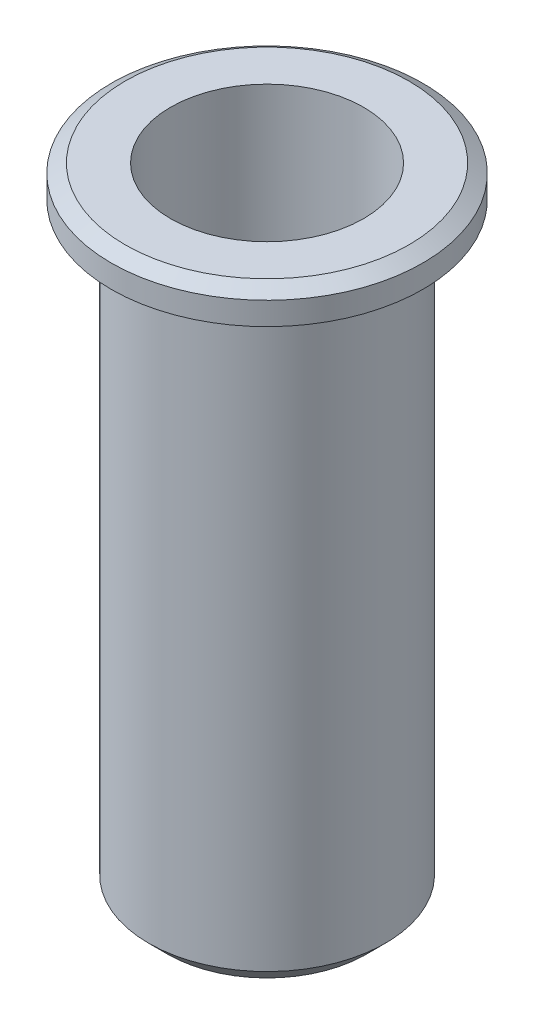
ISO-10303-21;
HEADER;
FILE_DESCRIPTION(('STEP AP214'),'2;1');
FILE_NAME('part.step','',(''),(''),'','','');
FILE_SCHEMA(('AUTOMOTIVE_DESIGN { 1 0 10303 214 1 1 1 1 }'));
ENDSEC;
DATA;
#1=APPLICATION_CONTEXT('core data for automotive mechanical design processes');
#2=APPLICATION_PROTOCOL_DEFINITION('international standard','automotive_design',2000,#1);
#3=PRODUCT_CONTEXT('',#1,'mechanical');
#4=PRODUCT('Part','Part','',(#3));
#5=PRODUCT_RELATED_PRODUCT_CATEGORY('part','',(#4));
#6=PRODUCT_DEFINITION_FORMATION('','',#4);
#7=PRODUCT_DEFINITION_CONTEXT('part definition',#1,'design');
#8=PRODUCT_DEFINITION('design','',#6,#7);
#9=PRODUCT_DEFINITION_SHAPE('','',#8);
#10=(LENGTH_UNIT() NAMED_UNIT(*) SI_UNIT(.MILLI.,.METRE.));
#11=(NAMED_UNIT(*) PLANE_ANGLE_UNIT() SI_UNIT($,.RADIAN.));
#12=(NAMED_UNIT(*) SI_UNIT($,.STERADIAN.) SOLID_ANGLE_UNIT());
#13=UNCERTAINTY_MEASURE_WITH_UNIT(LENGTH_MEASURE(1.E-05),#10,'distance_accuracy_value','');
#14=(GEOMETRIC_REPRESENTATION_CONTEXT(3) GLOBAL_UNCERTAINTY_ASSIGNED_CONTEXT((#13)) GLOBAL_UNIT_ASSIGNED_CONTEXT((#10,
#11,#12)) REPRESENTATION_CONTEXT('',''));
#15=CARTESIAN_POINT('',(0.,0.,0.));
#16=DIRECTION('',(0.,0.,1.));
#17=DIRECTION('',(1.,0.,0.));
#18=AXIS2_PLACEMENT_3D('',#15,#16,#17);
#19=CARTESIAN_POINT('',(0.,25.1479120878423,0.));
#20=DIRECTION('',(0.,1.,0.));
#21=DIRECTION('',(0.,0.,1.));
#22=AXIS2_PLACEMENT_3D('',#19,#20,#21);
#23=CYLINDRICAL_SURFACE('',#22,2.2987);
#24=CARTESIAN_POINT('',(0.,0.,0.));
#25=DIRECTION('',(0.,1.,0.));
#26=DIRECTION('',(0.,0.,1.));
#27=AXIS2_PLACEMENT_3D('',#24,#25,#26);
#28=CIRCLE('',#27,2.2987);
#29=CARTESIAN_POINT('',(0.,0.,2.2987));
#30=VERTEX_POINT('',#29);
#31=EDGE_CURVE('E10',#30,#30,#28,.T.);
#32=ORIENTED_EDGE('',*,*,#31,.F.);
#33=EDGE_LOOP('',(#32));
#34=FACE_BOUND('',#33,.T.);
#35=CARTESIAN_POINT('',(0.,2.36523438534684,0.));
#36=DIRECTION('',(0.,1.,0.));
#37=DIRECTION('',(0.,0.,1.));
#38=AXIS2_PLACEMENT_3D('',#35,#36,#37);
#39=CIRCLE('',#38,2.2987);
#40=CARTESIAN_POINT('',(0.,2.36523438534684,2.2987));
#41=VERTEX_POINT('',#40);
#42=EDGE_CURVE('E72',#41,#41,#39,.T.);
#43=ORIENTED_EDGE('',*,*,#42,.T.);
#44=EDGE_LOOP('',(#43));
#45=FACE_BOUND('',#44,.T.);
#46=ADVANCED_FACE('F40',(#34,#45),#23,.F.);
#47=CARTESIAN_POINT('',(2.2987,0.,0.));
#48=DIRECTION('',(0.,1.,0.));
#49=DIRECTION('',(0.,0.,1.));
#50=AXIS2_PLACEMENT_3D('',#47,#48,#49);
#51=PLANE('',#50);
#52=CARTESIAN_POINT('',(0.,0.,0.));
#53=DIRECTION('',(0.,1.,0.));
#54=DIRECTION('',(0.,0.,1.));
#55=AXIS2_PLACEMENT_3D('',#52,#53,#54);
#56=CIRCLE('',#55,3.98800000000001);
#57=CARTESIAN_POINT('',(0.,0.,3.98800000000001));
#58=VERTEX_POINT('',#57);
#59=EDGE_CURVE('E43',#58,#58,#56,.T.);
#60=ORIENTED_EDGE('',*,*,#59,.F.);
#61=EDGE_LOOP('',(#60));
#62=FACE_BOUND('',#61,.T.);
#63=ORIENTED_EDGE('',*,*,#31,.T.);
#64=EDGE_LOOP('',(#63));
#65=FACE_BOUND('',#64,.T.);
#66=ADVANCED_FACE('F118',(#62,#65),#51,.F.);
#67=CARTESIAN_POINT('',(0.,0.,0.));
#68=DIRECTION('',(0.,1.,0.));
#69=DIRECTION('',(0.,0.,1.));
#70=AXIS2_PLACEMENT_3D('',#67,#68,#69);
#71=CONICAL_SURFACE('',#70,3.98800000000001,0.785398163397447);
#72=CARTESIAN_POINT('',(0.,0.761999999999999,0.));
#73=DIRECTION('',(0.,1.,0.));
#74=DIRECTION('',(0.,0.,1.));
#75=AXIS2_PLACEMENT_3D('',#72,#73,#74);
#76=CIRCLE('',#75,4.75);
#77=CARTESIAN_POINT('',(0.,0.761999999999999,4.75));
#78=VERTEX_POINT('',#77);
#79=EDGE_CURVE('E50',#78,#78,#76,.T.);
#80=ORIENTED_EDGE('',*,*,#79,.F.);
#81=EDGE_LOOP('',(#80));
#82=FACE_BOUND('',#81,.T.);
#83=ORIENTED_EDGE('',*,*,#59,.T.);
#84=EDGE_LOOP('',(#83));
#85=FACE_BOUND('',#84,.T.);
#86=ADVANCED_FACE('F113',(#82,#85),#71,.T.);
#87=CARTESIAN_POINT('',(0.,25.1479120878423,0.));
#88=DIRECTION('',(0.,1.,0.));
#89=DIRECTION('',(0.,0.,1.));
#90=AXIS2_PLACEMENT_3D('',#87,#88,#89);
#91=CYLINDRICAL_SURFACE('',#90,4.75);
#92=CARTESIAN_POINT('',(0.,24.2316,0.));
#93=DIRECTION('',(0.,1.,0.));
#94=DIRECTION('',(0.,0.,1.));
#95=AXIS2_PLACEMENT_3D('',#92,#93,#94);
#96=CIRCLE('',#95,4.75);
#97=CARTESIAN_POINT('',(0.,24.2316,4.75));
#98=VERTEX_POINT('',#97);
#99=EDGE_CURVE('E51',#98,#98,#96,.T.);
#100=ORIENTED_EDGE('',*,*,#99,.F.);
#101=EDGE_LOOP('',(#100));
#102=FACE_BOUND('',#101,.T.);
#103=ORIENTED_EDGE('',*,*,#79,.T.);
#104=EDGE_LOOP('',(#103));
#105=FACE_BOUND('',#104,.T.);
#106=ADVANCED_FACE('F106',(#102,#105),#91,.T.);
#107=CARTESIAN_POINT('',(4.75,24.2316,0.));
#108=DIRECTION('',(0.,1.,0.));
#109=DIRECTION('',(0.,0.,1.));
#110=AXIS2_PLACEMENT_3D('',#107,#108,#109);
#111=PLANE('',#110);
#112=CARTESIAN_POINT('',(0.,24.2316,0.));
#113=DIRECTION('',(0.,1.,0.));
#114=DIRECTION('',(0.,0.,1.));
#115=AXIS2_PLACEMENT_3D('',#112,#113,#114);
#116=CIRCLE('',#115,6.25);
#117=CARTESIAN_POINT('',(0.,24.2316,6.25));
#118=VERTEX_POINT('',#117);
#119=EDGE_CURVE('E57',#118,#118,#116,.T.);
#120=ORIENTED_EDGE('',*,*,#119,.F.);
#121=EDGE_LOOP('',(#120));
#122=FACE_BOUND('',#121,.T.);
#123=ORIENTED_EDGE('',*,*,#99,.T.);
#124=EDGE_LOOP('',(#123));
#125=FACE_BOUND('',#124,.T.);
#126=ADVANCED_FACE('F104',(#122,#125),#111,.F.);
#127=CARTESIAN_POINT('',(0.,25.1479120878423,0.));
#128=DIRECTION('',(0.,1.,0.));
#129=DIRECTION('',(0.,0.,1.));
#130=AXIS2_PLACEMENT_3D('',#127,#128,#129);
#131=CYLINDRICAL_SURFACE('',#130,6.25);
#132=CARTESIAN_POINT('',(0.,25.1479120878423,0.));
#133=DIRECTION('',(0.,1.,0.));
#134=DIRECTION('',(0.,0.,1.));
#135=AXIS2_PLACEMENT_3D('',#132,#133,#134);
#136=CIRCLE('',#135,6.25);
#137=CARTESIAN_POINT('',(0.,25.1479120878423,6.25));
#138=VERTEX_POINT('',#137);
#139=EDGE_CURVE('E56',#138,#138,#136,.T.);
#140=ORIENTED_EDGE('',*,*,#139,.F.);
#141=EDGE_LOOP('',(#140));
#142=FACE_BOUND('',#141,.T.);
#143=ORIENTED_EDGE('',*,*,#119,.T.);
#144=EDGE_LOOP('',(#143));
#145=FACE_BOUND('',#144,.T.);
#146=ADVANCED_FACE('F100',(#142,#145),#131,.T.);
#147=CARTESIAN_POINT('',(0.,25.1479120878423,0.));
#148=DIRECTION('',(0.,-1.,0.));
#149=DIRECTION('',(0.,0.,-1.));
#150=AXIS2_PLACEMENT_3D('',#147,#148,#149);
#151=CONICAL_SURFACE('',#150,6.25,1.00516004439656);
#152=CARTESIAN_POINT('',(0.,25.5016,0.));
#153=DIRECTION('',(0.,1.,0.));
#154=DIRECTION('',(0.,0.,1.));
#155=AXIS2_PLACEMENT_3D('',#152,#153,#154);
#156=CIRCLE('',#155,5.69286128224378);
#157=CARTESIAN_POINT('',(0.,25.5016,5.69286128224378));
#158=VERTEX_POINT('',#157);
#159=EDGE_CURVE('E64',#158,#158,#156,.T.);
#160=ORIENTED_EDGE('',*,*,#159,.F.);
#161=EDGE_LOOP('',(#160));
#162=FACE_BOUND('',#161,.T.);
#163=ORIENTED_EDGE('',*,*,#139,.T.);
#164=EDGE_LOOP('',(#163));
#165=FACE_BOUND('',#164,.T.);
#166=ADVANCED_FACE('F91',(#162,#165),#151,.T.);
#167=CARTESIAN_POINT('',(5.69286128224378,25.5016,0.));
#168=DIRECTION('',(0.,-1.,0.));
#169=DIRECTION('',(0.,0.,-1.));
#170=AXIS2_PLACEMENT_3D('',#167,#168,#169);
#171=PLANE('',#170);
#172=CARTESIAN_POINT('',(0.,25.5016,0.));
#173=DIRECTION('',(0.,1.,0.));
#174=DIRECTION('',(0.,0.,1.));
#175=AXIS2_PLACEMENT_3D('',#172,#173,#174);
#176=CIRCLE('',#175,3.8735);
#177=CARTESIAN_POINT('',(0.,25.5016,3.8735));
#178=VERTEX_POINT('',#177);
#179=EDGE_CURVE('E63',#178,#178,#176,.T.);
#180=ORIENTED_EDGE('',*,*,#179,.F.);
#181=EDGE_LOOP('',(#180));
#182=FACE_BOUND('',#181,.T.);
#183=ORIENTED_EDGE('',*,*,#159,.T.);
#184=EDGE_LOOP('',(#183));
#185=FACE_BOUND('',#184,.T.);
#186=ADVANCED_FACE('F82',(#182,#185),#171,.F.);
#187=CARTESIAN_POINT('',(0.,25.1479120878423,0.));
#188=DIRECTION('',(0.,1.,0.));
#189=DIRECTION('',(0.,0.,1.));
#190=AXIS2_PLACEMENT_3D('',#187,#188,#189);
#191=CYLINDRICAL_SURFACE('',#190,3.8735);
#192=CARTESIAN_POINT('',(0.,2.36523438534684,0.));
#193=DIRECTION('',(0.,1.,0.));
#194=DIRECTION('',(0.,0.,1.));
#195=AXIS2_PLACEMENT_3D('',#192,#193,#194);
#196=CIRCLE('',#195,3.8735);
#197=CARTESIAN_POINT('',(0.,2.36523438534684,3.8735));
#198=VERTEX_POINT('',#197);
#199=EDGE_CURVE('E66',#198,#198,#196,.T.);
#200=ORIENTED_EDGE('',*,*,#199,.F.);
#201=EDGE_LOOP('',(#200));
#202=FACE_BOUND('',#201,.T.);
#203=ORIENTED_EDGE('',*,*,#179,.T.);
#204=EDGE_LOOP('',(#203));
#205=FACE_BOUND('',#204,.T.);
#206=ADVANCED_FACE('F80',(#202,#205),#191,.F.);
#207=CARTESIAN_POINT('',(3.8735,2.36523438534684,0.));
#208=DIRECTION('',(0.,-1.,0.));
#209=DIRECTION('',(0.,0.,-1.));
#210=AXIS2_PLACEMENT_3D('',#207,#208,#209);
#211=PLANE('',#210);
#212=ORIENTED_EDGE('',*,*,#42,.F.);
#213=EDGE_LOOP('',(#212));
#214=FACE_BOUND('',#213,.T.);
#215=ORIENTED_EDGE('',*,*,#199,.T.);
#216=EDGE_LOOP('',(#215));
#217=FACE_BOUND('',#216,.T.);
#218=ADVANCED_FACE('F78',(#214,#217),#211,.F.);
#219=CLOSED_SHELL('',(#46,#66,#86,#106,#126,#146,#166,#186,#206,#218));
#220=MANIFOLD_SOLID_BREP('B2',#219);
#221=ADVANCED_BREP_SHAPE_REPRESENTATION('',(#18,#220),#14);
#222=SHAPE_DEFINITION_REPRESENTATION(#9,#221);
ENDSEC;
END-ISO-10303-21;
